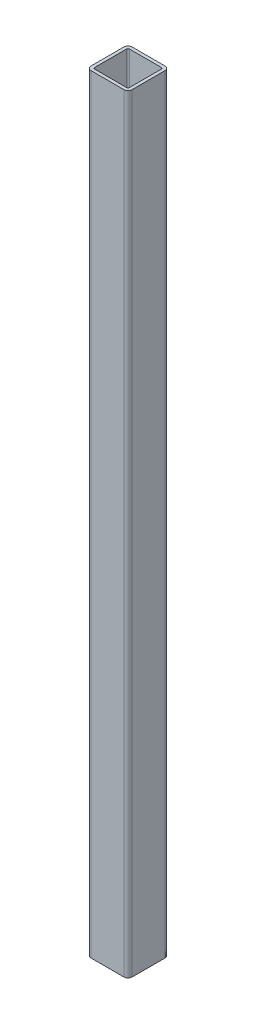
ISO-10303-21;
HEADER;
FILE_DESCRIPTION(('STEP AP214'),'2;1');
FILE_NAME('part.step','',(''),(''),'','','');
FILE_SCHEMA(('AUTOMOTIVE_DESIGN { 1 0 10303 214 1 1 1 1 }'));
ENDSEC;
DATA;
#1=APPLICATION_CONTEXT('core data for automotive mechanical design processes');
#2=APPLICATION_PROTOCOL_DEFINITION('international standard','automotive_design',2000,#1);
#3=PRODUCT_CONTEXT('',#1,'mechanical');
#4=PRODUCT('Part','Part','',(#3));
#5=PRODUCT_RELATED_PRODUCT_CATEGORY('part','',(#4));
#6=PRODUCT_DEFINITION_FORMATION('','',#4);
#7=PRODUCT_DEFINITION_CONTEXT('part definition',#1,'design');
#8=PRODUCT_DEFINITION('design','',#6,#7);
#9=PRODUCT_DEFINITION_SHAPE('','',#8);
#10=(LENGTH_UNIT() NAMED_UNIT(*) SI_UNIT(.MILLI.,.METRE.));
#11=(NAMED_UNIT(*) PLANE_ANGLE_UNIT() SI_UNIT($,.RADIAN.));
#12=(NAMED_UNIT(*) SI_UNIT($,.STERADIAN.) SOLID_ANGLE_UNIT());
#13=UNCERTAINTY_MEASURE_WITH_UNIT(LENGTH_MEASURE(1.E-05),#10,'distance_accuracy_value','');
#14=(GEOMETRIC_REPRESENTATION_CONTEXT(3) GLOBAL_UNCERTAINTY_ASSIGNED_CONTEXT((#13)) GLOBAL_UNIT_ASSIGNED_CONTEXT((#10,
#11,#12)) REPRESENTATION_CONTEXT('',''));
#15=CARTESIAN_POINT('',(0.,0.,0.));
#16=DIRECTION('',(0.,0.,1.));
#17=DIRECTION('',(1.,0.,0.));
#18=AXIS2_PLACEMENT_3D('',#15,#16,#17);
#19=CARTESIAN_POINT('',(16.,375.,-16.));
#20=DIRECTION('',(0.,-1.,0.));
#21=DIRECTION('',(0.,0.,-1.));
#22=AXIS2_PLACEMENT_3D('',#19,#20,#21);
#23=PLANE('',#22);
#24=CARTESIAN_POINT('',(16.,375.,-16.));
#25=DIRECTION('',(0.,1.,0.));
#26=DIRECTION('',(0.,0.,-1.));
#27=AXIS2_PLACEMENT_3D('',#24,#25,#26);
#28=CIRCLE('',#27,4.00000000000001);
#29=CARTESIAN_POINT('',(20.,375.,-16.));
#30=VERTEX_POINT('',#29);
#31=CARTESIAN_POINT('',(16.,375.,-20.));
#32=VERTEX_POINT('',#31);
#33=EDGE_CURVE('E220',#30,#32,#28,.T.);
#34=ORIENTED_EDGE('',*,*,#33,.T.);
#35=DIRECTION('',(-1.,0.,0.));
#36=VECTOR('',#35,1.);
#37=CARTESIAN_POINT('',(-16.,375.,-20.));
#38=LINE('',#37,#36);
#39=CARTESIAN_POINT('',(-16.,375.,-20.));
#40=VERTEX_POINT('',#39);
#41=EDGE_CURVE('E217',#32,#40,#38,.T.);
#42=ORIENTED_EDGE('',*,*,#41,.T.);
#43=CARTESIAN_POINT('',(-16.,375.,-16.));
#44=DIRECTION('',(0.,1.,0.));
#45=DIRECTION('',(0.,0.,-1.));
#46=AXIS2_PLACEMENT_3D('',#43,#44,#45);
#47=CIRCLE('',#46,4.00000000000001);
#48=CARTESIAN_POINT('',(-20.,375.,-16.));
#49=VERTEX_POINT('',#48);
#50=EDGE_CURVE('E223',#40,#49,#47,.T.);
#51=ORIENTED_EDGE('',*,*,#50,.T.);
#52=DIRECTION('',(0.,0.,1.));
#53=VECTOR('',#52,1.);
#54=CARTESIAN_POINT('',(-20.,375.,16.));
#55=LINE('',#54,#53);
#56=CARTESIAN_POINT('',(-20.,375.,16.));
#57=VERTEX_POINT('',#56);
#58=EDGE_CURVE('E224',#49,#57,#55,.T.);
#59=ORIENTED_EDGE('',*,*,#58,.T.);
#60=CARTESIAN_POINT('',(-16.,375.,16.));
#61=DIRECTION('',(0.,1.,0.));
#62=DIRECTION('',(0.,0.,-1.));
#63=AXIS2_PLACEMENT_3D('',#60,#61,#62);
#64=CIRCLE('',#63,4.00000000000001);
#65=CARTESIAN_POINT('',(-16.,375.,20.));
#66=VERTEX_POINT('',#65);
#67=EDGE_CURVE('E230',#57,#66,#64,.T.);
#68=ORIENTED_EDGE('',*,*,#67,.T.);
#69=DIRECTION('',(1.,0.,0.));
#70=VECTOR('',#69,1.);
#71=CARTESIAN_POINT('',(16.,375.,20.));
#72=LINE('',#71,#70);
#73=CARTESIAN_POINT('',(16.,375.,20.));
#74=VERTEX_POINT('',#73);
#75=EDGE_CURVE('E227',#66,#74,#72,.T.);
#76=ORIENTED_EDGE('',*,*,#75,.T.);
#77=CARTESIAN_POINT('',(16.,375.,16.));
#78=DIRECTION('',(0.,1.,0.));
#79=DIRECTION('',(0.,0.,-1.));
#80=AXIS2_PLACEMENT_3D('',#77,#78,#79);
#81=CIRCLE('',#80,4.00000000000001);
#82=CARTESIAN_POINT('',(20.,375.,16.));
#83=VERTEX_POINT('',#82);
#84=EDGE_CURVE('E231',#74,#83,#81,.T.);
#85=ORIENTED_EDGE('',*,*,#84,.T.);
#86=DIRECTION('',(0.,0.,-1.));
#87=VECTOR('',#86,1.);
#88=CARTESIAN_POINT('',(20.,375.,-16.));
#89=LINE('',#88,#87);
#90=EDGE_CURVE('E232',#83,#30,#89,.T.);
#91=ORIENTED_EDGE('',*,*,#90,.T.);
#92=EDGE_LOOP('',(#34,#42,#51,#59,#68,#76,#85,#91));
#93=FACE_BOUND('',#92,.T.);
#94=CARTESIAN_POINT('',(15.5,375.,-15.5));
#95=DIRECTION('',(0.,1.,0.));
#96=DIRECTION('',(0.,0.,-1.));
#97=AXIS2_PLACEMENT_3D('',#94,#95,#96);
#98=CIRCLE('',#97,1.5);
#99=CARTESIAN_POINT('',(17.,375.,-15.5));
#100=VERTEX_POINT('',#99);
#101=CARTESIAN_POINT('',(15.5,375.,-17.));
#102=VERTEX_POINT('',#101);
#103=EDGE_CURVE('E154',#100,#102,#98,.T.);
#104=ORIENTED_EDGE('',*,*,#103,.F.);
#105=DIRECTION('',(0.,0.,-1.));
#106=VECTOR('',#105,1.);
#107=CARTESIAN_POINT('',(17.,375.,-15.5));
#108=LINE('',#107,#106);
#109=CARTESIAN_POINT('',(17.,375.,15.5));
#110=VERTEX_POINT('',#109);
#111=EDGE_CURVE('E184',#110,#100,#108,.T.);
#112=ORIENTED_EDGE('',*,*,#111,.F.);
#113=CARTESIAN_POINT('',(15.5,375.,15.5));
#114=DIRECTION('',(0.,1.,0.));
#115=DIRECTION('',(0.,0.,-1.));
#116=AXIS2_PLACEMENT_3D('',#113,#114,#115);
#117=CIRCLE('',#116,1.5);
#118=CARTESIAN_POINT('',(15.5,375.,17.));
#119=VERTEX_POINT('',#118);
#120=EDGE_CURVE('E183',#119,#110,#117,.T.);
#121=ORIENTED_EDGE('',*,*,#120,.F.);
#122=DIRECTION('',(1.,0.,0.));
#123=VECTOR('',#122,1.);
#124=CARTESIAN_POINT('',(15.5,375.,17.));
#125=LINE('',#124,#123);
#126=CARTESIAN_POINT('',(-15.5,375.,17.));
#127=VERTEX_POINT('',#126);
#128=EDGE_CURVE('E181',#127,#119,#125,.T.);
#129=ORIENTED_EDGE('',*,*,#128,.F.);
#130=CARTESIAN_POINT('',(-15.5,375.,15.5));
#131=DIRECTION('',(0.,1.,0.));
#132=DIRECTION('',(0.,0.,-1.));
#133=AXIS2_PLACEMENT_3D('',#130,#131,#132);
#134=CIRCLE('',#133,1.5);
#135=CARTESIAN_POINT('',(-17.,375.,15.5));
#136=VERTEX_POINT('',#135);
#137=EDGE_CURVE('E177',#136,#127,#134,.T.);
#138=ORIENTED_EDGE('',*,*,#137,.F.);
#139=DIRECTION('',(0.,0.,1.));
#140=VECTOR('',#139,1.);
#141=CARTESIAN_POINT('',(-17.,375.,15.5));
#142=LINE('',#141,#140);
#143=CARTESIAN_POINT('',(-17.,375.,-15.5));
#144=VERTEX_POINT('',#143);
#145=EDGE_CURVE('E172',#144,#136,#142,.T.);
#146=ORIENTED_EDGE('',*,*,#145,.F.);
#147=CARTESIAN_POINT('',(-15.5,375.,-15.5));
#148=DIRECTION('',(0.,1.,0.));
#149=DIRECTION('',(0.,0.,-1.));
#150=AXIS2_PLACEMENT_3D('',#147,#148,#149);
#151=CIRCLE('',#150,1.5);
#152=CARTESIAN_POINT('',(-15.5,375.,-17.));
#153=VERTEX_POINT('',#152);
#154=EDGE_CURVE('E171',#153,#144,#151,.T.);
#155=ORIENTED_EDGE('',*,*,#154,.F.);
#156=DIRECTION('',(-1.,0.,0.));
#157=VECTOR('',#156,1.);
#158=CARTESIAN_POINT('',(-15.5,375.,-17.));
#159=LINE('',#158,#157);
#160=EDGE_CURVE('E158',#102,#153,#159,.T.);
#161=ORIENTED_EDGE('',*,*,#160,.F.);
#162=EDGE_LOOP('',(#104,#112,#121,#129,#138,#146,#155,#161));
#163=FACE_BOUND('',#162,.T.);
#164=ADVANCED_FACE('F39',(#93,#163),#23,.F.);
#165=CARTESIAN_POINT('',(16.,-375.,-16.));
#166=DIRECTION('',(0.,-1.,0.));
#167=DIRECTION('',(0.,0.,-1.));
#168=AXIS2_PLACEMENT_3D('',#165,#166,#167);
#169=PLANE('',#168);
#170=CARTESIAN_POINT('',(16.,-375.,-16.));
#171=DIRECTION('',(0.,1.,0.));
#172=DIRECTION('',(0.,0.,-1.));
#173=AXIS2_PLACEMENT_3D('',#170,#171,#172);
#174=CIRCLE('',#173,4.00000000000001);
#175=CARTESIAN_POINT('',(20.,-375.,-16.));
#176=VERTEX_POINT('',#175);
#177=CARTESIAN_POINT('',(16.,-375.,-20.));
#178=VERTEX_POINT('',#177);
#179=EDGE_CURVE('E166',#176,#178,#174,.T.);
#180=ORIENTED_EDGE('',*,*,#179,.F.);
#181=DIRECTION('',(0.,0.,-1.));
#182=VECTOR('',#181,1.);
#183=CARTESIAN_POINT('',(20.,-375.,-16.));
#184=LINE('',#183,#182);
#185=CARTESIAN_POINT('',(20.,-375.,16.));
#186=VERTEX_POINT('',#185);
#187=EDGE_CURVE('E221',#186,#176,#184,.T.);
#188=ORIENTED_EDGE('',*,*,#187,.F.);
#189=CARTESIAN_POINT('',(16.,-375.,16.));
#190=DIRECTION('',(0.,1.,0.));
#191=DIRECTION('',(0.,0.,-1.));
#192=AXIS2_PLACEMENT_3D('',#189,#190,#191);
#193=CIRCLE('',#192,4.00000000000001);
#194=CARTESIAN_POINT('',(16.,-375.,20.));
#195=VERTEX_POINT('',#194);
#196=EDGE_CURVE('E246',#195,#186,#193,.T.);
#197=ORIENTED_EDGE('',*,*,#196,.F.);
#198=DIRECTION('',(1.,0.,0.));
#199=VECTOR('',#198,1.);
#200=CARTESIAN_POINT('',(16.,-375.,20.));
#201=LINE('',#200,#199);
#202=CARTESIAN_POINT('',(-16.,-375.,20.));
#203=VERTEX_POINT('',#202);
#204=EDGE_CURVE('E247',#203,#195,#201,.T.);
#205=ORIENTED_EDGE('',*,*,#204,.F.);
#206=CARTESIAN_POINT('',(-16.,-375.,16.));
#207=DIRECTION('',(0.,1.,0.));
#208=DIRECTION('',(0.,0.,-1.));
#209=AXIS2_PLACEMENT_3D('',#206,#207,#208);
#210=CIRCLE('',#209,4.00000000000001);
#211=CARTESIAN_POINT('',(-20.,-375.,16.));
#212=VERTEX_POINT('',#211);
#213=EDGE_CURVE('E241',#212,#203,#210,.T.);
#214=ORIENTED_EDGE('',*,*,#213,.F.);
#215=DIRECTION('',(0.,0.,1.));
#216=VECTOR('',#215,1.);
#217=CARTESIAN_POINT('',(-20.,-375.,16.));
#218=LINE('',#217,#216);
#219=CARTESIAN_POINT('',(-20.,-375.,-16.));
#220=VERTEX_POINT('',#219);
#221=EDGE_CURVE('E244',#220,#212,#218,.T.);
#222=ORIENTED_EDGE('',*,*,#221,.F.);
#223=CARTESIAN_POINT('',(-16.,-375.,-16.));
#224=DIRECTION('',(0.,1.,0.));
#225=DIRECTION('',(0.,0.,-1.));
#226=AXIS2_PLACEMENT_3D('',#223,#224,#225);
#227=CIRCLE('',#226,4.00000000000001);
#228=CARTESIAN_POINT('',(-16.,-375.,-20.));
#229=VERTEX_POINT('',#228);
#230=EDGE_CURVE('E238',#229,#220,#227,.T.);
#231=ORIENTED_EDGE('',*,*,#230,.F.);
#232=DIRECTION('',(-1.,0.,0.));
#233=VECTOR('',#232,1.);
#234=CARTESIAN_POINT('',(-16.,-375.,-20.));
#235=LINE('',#234,#233);
#236=EDGE_CURVE('E239',#178,#229,#235,.T.);
#237=ORIENTED_EDGE('',*,*,#236,.F.);
#238=EDGE_LOOP('',(#180,#188,#197,#205,#214,#222,#231,#237));
#239=FACE_BOUND('',#238,.T.);
#240=DIRECTION('',(0.,0.,-1.));
#241=VECTOR('',#240,1.);
#242=CARTESIAN_POINT('',(17.,-375.,-15.5));
#243=LINE('',#242,#241);
#244=CARTESIAN_POINT('',(17.,-375.,15.5));
#245=VERTEX_POINT('',#244);
#246=CARTESIAN_POINT('',(17.,-375.,-15.5));
#247=VERTEX_POINT('',#246);
#248=EDGE_CURVE('E162',#245,#247,#243,.T.);
#249=ORIENTED_EDGE('',*,*,#248,.T.);
#250=CARTESIAN_POINT('',(15.5,-375.,-15.5));
#251=DIRECTION('',(0.,1.,0.));
#252=DIRECTION('',(0.,0.,-1.));
#253=AXIS2_PLACEMENT_3D('',#250,#251,#252);
#254=CIRCLE('',#253,1.5);
#255=CARTESIAN_POINT('',(15.5,-375.,-17.));
#256=VERTEX_POINT('',#255);
#257=EDGE_CURVE('E64',#247,#256,#254,.T.);
#258=ORIENTED_EDGE('',*,*,#257,.T.);
#259=DIRECTION('',(-1.,0.,0.));
#260=VECTOR('',#259,1.);
#261=CARTESIAN_POINT('',(-15.5,-375.,-17.));
#262=LINE('',#261,#260);
#263=CARTESIAN_POINT('',(-15.5,-375.,-17.));
#264=VERTEX_POINT('',#263);
#265=EDGE_CURVE('E167',#256,#264,#262,.T.);
#266=ORIENTED_EDGE('',*,*,#265,.T.);
#267=CARTESIAN_POINT('',(-15.5,-375.,-15.5));
#268=DIRECTION('',(0.,1.,0.));
#269=DIRECTION('',(0.,0.,-1.));
#270=AXIS2_PLACEMENT_3D('',#267,#268,#269);
#271=CIRCLE('',#270,1.5);
#272=CARTESIAN_POINT('',(-17.,-375.,-15.5));
#273=VERTEX_POINT('',#272);
#274=EDGE_CURVE('E188',#264,#273,#271,.T.);
#275=ORIENTED_EDGE('',*,*,#274,.T.);
#276=DIRECTION('',(0.,0.,1.));
#277=VECTOR('',#276,1.);
#278=CARTESIAN_POINT('',(-17.,-375.,15.5));
#279=LINE('',#278,#277);
#280=CARTESIAN_POINT('',(-17.,-375.,15.5));
#281=VERTEX_POINT('',#280);
#282=EDGE_CURVE('E195',#273,#281,#279,.T.);
#283=ORIENTED_EDGE('',*,*,#282,.T.);
#284=CARTESIAN_POINT('',(-15.5,-375.,15.5));
#285=DIRECTION('',(0.,1.,0.));
#286=DIRECTION('',(0.,0.,-1.));
#287=AXIS2_PLACEMENT_3D('',#284,#285,#286);
#288=CIRCLE('',#287,1.5);
#289=CARTESIAN_POINT('',(-15.5,-375.,17.));
#290=VERTEX_POINT('',#289);
#291=EDGE_CURVE('E193',#281,#290,#288,.T.);
#292=ORIENTED_EDGE('',*,*,#291,.T.);
#293=DIRECTION('',(1.,0.,0.));
#294=VECTOR('',#293,1.);
#295=CARTESIAN_POINT('',(15.5,-375.,17.));
#296=LINE('',#295,#294);
#297=CARTESIAN_POINT('',(15.5,-375.,17.));
#298=VERTEX_POINT('',#297);
#299=EDGE_CURVE('E200',#290,#298,#296,.T.);
#300=ORIENTED_EDGE('',*,*,#299,.T.);
#301=CARTESIAN_POINT('',(15.5,-375.,15.5));
#302=DIRECTION('',(0.,1.,0.));
#303=DIRECTION('',(0.,0.,-1.));
#304=AXIS2_PLACEMENT_3D('',#301,#302,#303);
#305=CIRCLE('',#304,1.5);
#306=EDGE_CURVE('E202',#298,#245,#305,.T.);
#307=ORIENTED_EDGE('',*,*,#306,.T.);
#308=EDGE_LOOP('',(#249,#258,#266,#275,#283,#292,#300,#307));
#309=FACE_BOUND('',#308,.T.);
#310=ADVANCED_FACE('F277',(#239,#309),#169,.T.);
#311=CARTESIAN_POINT('',(16.,375.,-16.));
#312=DIRECTION('',(0.,-1.,0.));
#313=DIRECTION('',(0.,0.,-1.));
#314=AXIS2_PLACEMENT_3D('',#311,#312,#313);
#315=CYLINDRICAL_SURFACE('',#314,4.00000000000001);
#316=ORIENTED_EDGE('',*,*,#179,.T.);
#317=DIRECTION('',(0.,-1.,0.));
#318=VECTOR('',#317,1.);
#319=CARTESIAN_POINT('',(16.,375.,-20.));
#320=LINE('',#319,#318);
#321=EDGE_CURVE('E11',#32,#178,#320,.T.);
#322=ORIENTED_EDGE('',*,*,#321,.F.);
#323=ORIENTED_EDGE('',*,*,#33,.F.);
#324=DIRECTION('',(0.,-1.,0.));
#325=VECTOR('',#324,1.);
#326=CARTESIAN_POINT('',(20.,375.,-16.));
#327=LINE('',#326,#325);
#328=EDGE_CURVE('E234',#30,#176,#327,.T.);
#329=ORIENTED_EDGE('',*,*,#328,.T.);
#330=EDGE_LOOP('',(#316,#322,#323,#329));
#331=FACE_BOUND('',#330,.T.);
#332=ADVANCED_FACE('F41',(#331),#315,.T.);
#333=CARTESIAN_POINT('',(-16.,375.,-20.));
#334=DIRECTION('',(0.,0.,1.));
#335=DIRECTION('',(1.,0.,0.));
#336=AXIS2_PLACEMENT_3D('',#333,#334,#335);
#337=PLANE('',#336);
#338=ORIENTED_EDGE('',*,*,#236,.T.);
#339=DIRECTION('',(0.,-1.,0.));
#340=VECTOR('',#339,1.);
#341=CARTESIAN_POINT('',(-16.,375.,-20.));
#342=LINE('',#341,#340);
#343=EDGE_CURVE('E50',#40,#229,#342,.T.);
#344=ORIENTED_EDGE('',*,*,#343,.F.);
#345=ORIENTED_EDGE('',*,*,#41,.F.);
#346=ORIENTED_EDGE('',*,*,#321,.T.);
#347=EDGE_LOOP('',(#338,#344,#345,#346));
#348=FACE_BOUND('',#347,.T.);
#349=ADVANCED_FACE('F293',(#348),#337,.F.);
#350=CARTESIAN_POINT('',(-16.,375.,-16.));
#351=DIRECTION('',(0.,-1.,0.));
#352=DIRECTION('',(0.,0.,-1.));
#353=AXIS2_PLACEMENT_3D('',#350,#351,#352);
#354=CYLINDRICAL_SURFACE('',#353,4.00000000000001);
#355=ORIENTED_EDGE('',*,*,#230,.T.);
#356=DIRECTION('',(0.,-1.,0.));
#357=VECTOR('',#356,1.);
#358=CARTESIAN_POINT('',(-20.,375.,-16.));
#359=LINE('',#358,#357);
#360=EDGE_CURVE('E262',#49,#220,#359,.T.);
#361=ORIENTED_EDGE('',*,*,#360,.F.);
#362=ORIENTED_EDGE('',*,*,#50,.F.);
#363=ORIENTED_EDGE('',*,*,#343,.T.);
#364=EDGE_LOOP('',(#355,#361,#362,#363));
#365=FACE_BOUND('',#364,.T.);
#366=ADVANCED_FACE('F275',(#365),#354,.T.);
#367=CARTESIAN_POINT('',(-20.,375.,16.));
#368=DIRECTION('',(1.,0.,0.));
#369=DIRECTION('',(0.,0.,-1.));
#370=AXIS2_PLACEMENT_3D('',#367,#368,#369);
#371=PLANE('',#370);
#372=ORIENTED_EDGE('',*,*,#221,.T.);
#373=DIRECTION('',(0.,-1.,0.));
#374=VECTOR('',#373,1.);
#375=CARTESIAN_POINT('',(-20.,375.,16.));
#376=LINE('',#375,#374);
#377=EDGE_CURVE('E265',#57,#212,#376,.T.);
#378=ORIENTED_EDGE('',*,*,#377,.F.);
#379=ORIENTED_EDGE('',*,*,#58,.F.);
#380=ORIENTED_EDGE('',*,*,#360,.T.);
#381=EDGE_LOOP('',(#372,#378,#379,#380));
#382=FACE_BOUND('',#381,.T.);
#383=ADVANCED_FACE('F281',(#382),#371,.F.);
#384=CARTESIAN_POINT('',(-16.,375.,16.));
#385=DIRECTION('',(0.,-1.,0.));
#386=DIRECTION('',(0.,0.,-1.));
#387=AXIS2_PLACEMENT_3D('',#384,#385,#386);
#388=CYLINDRICAL_SURFACE('',#387,4.00000000000001);
#389=ORIENTED_EDGE('',*,*,#213,.T.);
#390=DIRECTION('',(0.,-1.,0.));
#391=VECTOR('',#390,1.);
#392=CARTESIAN_POINT('',(-16.,375.,20.));
#393=LINE('',#392,#391);
#394=EDGE_CURVE('E260',#66,#203,#393,.T.);
#395=ORIENTED_EDGE('',*,*,#394,.F.);
#396=ORIENTED_EDGE('',*,*,#67,.F.);
#397=ORIENTED_EDGE('',*,*,#377,.T.);
#398=EDGE_LOOP('',(#389,#395,#396,#397));
#399=FACE_BOUND('',#398,.T.);
#400=ADVANCED_FACE('F290',(#399),#388,.T.);
#401=CARTESIAN_POINT('',(16.,375.,20.));
#402=DIRECTION('',(0.,0.,-1.));
#403=DIRECTION('',(-1.,0.,0.));
#404=AXIS2_PLACEMENT_3D('',#401,#402,#403);
#405=PLANE('',#404);
#406=ORIENTED_EDGE('',*,*,#204,.T.);
#407=DIRECTION('',(0.,-1.,0.));
#408=VECTOR('',#407,1.);
#409=CARTESIAN_POINT('',(16.,375.,20.));
#410=LINE('',#409,#408);
#411=EDGE_CURVE('E258',#74,#195,#410,.T.);
#412=ORIENTED_EDGE('',*,*,#411,.F.);
#413=ORIENTED_EDGE('',*,*,#75,.F.);
#414=ORIENTED_EDGE('',*,*,#394,.T.);
#415=EDGE_LOOP('',(#406,#412,#413,#414));
#416=FACE_BOUND('',#415,.T.);
#417=ADVANCED_FACE('F306',(#416),#405,.F.);
#418=CARTESIAN_POINT('',(16.,375.,16.));
#419=DIRECTION('',(0.,-1.,0.));
#420=DIRECTION('',(0.,0.,-1.));
#421=AXIS2_PLACEMENT_3D('',#418,#419,#420);
#422=CYLINDRICAL_SURFACE('',#421,4.00000000000001);
#423=ORIENTED_EDGE('',*,*,#196,.T.);
#424=DIRECTION('',(0.,-1.,0.));
#425=VECTOR('',#424,1.);
#426=CARTESIAN_POINT('',(20.,375.,16.));
#427=LINE('',#426,#425);
#428=EDGE_CURVE('E255',#83,#186,#427,.T.);
#429=ORIENTED_EDGE('',*,*,#428,.F.);
#430=ORIENTED_EDGE('',*,*,#84,.F.);
#431=ORIENTED_EDGE('',*,*,#411,.T.);
#432=EDGE_LOOP('',(#423,#429,#430,#431));
#433=FACE_BOUND('',#432,.T.);
#434=ADVANCED_FACE('F308',(#433),#422,.T.);
#435=CARTESIAN_POINT('',(20.,375.,-16.));
#436=DIRECTION('',(-1.,0.,0.));
#437=DIRECTION('',(0.,0.,1.));
#438=AXIS2_PLACEMENT_3D('',#435,#436,#437);
#439=PLANE('',#438);
#440=ORIENTED_EDGE('',*,*,#187,.T.);
#441=ORIENTED_EDGE('',*,*,#328,.F.);
#442=ORIENTED_EDGE('',*,*,#90,.F.);
#443=ORIENTED_EDGE('',*,*,#428,.T.);
#444=EDGE_LOOP('',(#440,#441,#442,#443));
#445=FACE_BOUND('',#444,.T.);
#446=ADVANCED_FACE('F303',(#445),#439,.F.);
#447=CARTESIAN_POINT('',(15.5,375.,-15.5));
#448=DIRECTION('',(0.,-1.,0.));
#449=DIRECTION('',(0.,0.,-1.));
#450=AXIS2_PLACEMENT_3D('',#447,#448,#449);
#451=CYLINDRICAL_SURFACE('',#450,1.5);
#452=ORIENTED_EDGE('',*,*,#257,.F.);
#453=DIRECTION('',(0.,-1.,0.));
#454=VECTOR('',#453,1.);
#455=CARTESIAN_POINT('',(17.,375.,-15.5));
#456=LINE('',#455,#454);
#457=EDGE_CURVE('E157',#100,#247,#456,.T.);
#458=ORIENTED_EDGE('',*,*,#457,.F.);
#459=ORIENTED_EDGE('',*,*,#103,.T.);
#460=DIRECTION('',(0.,-1.,0.));
#461=VECTOR('',#460,1.);
#462=CARTESIAN_POINT('',(15.5,375.,-17.));
#463=LINE('',#462,#461);
#464=EDGE_CURVE('E153',#102,#256,#463,.T.);
#465=ORIENTED_EDGE('',*,*,#464,.T.);
#466=EDGE_LOOP('',(#452,#458,#459,#465));
#467=FACE_BOUND('',#466,.T.);
#468=ADVANCED_FACE('F151',(#467),#451,.F.);
#469=CARTESIAN_POINT('',(-15.5,375.,-17.));
#470=DIRECTION('',(0.,0.,1.));
#471=DIRECTION('',(1.,0.,0.));
#472=AXIS2_PLACEMENT_3D('',#469,#470,#471);
#473=PLANE('',#472);
#474=ORIENTED_EDGE('',*,*,#265,.F.);
#475=ORIENTED_EDGE('',*,*,#464,.F.);
#476=ORIENTED_EDGE('',*,*,#160,.T.);
#477=DIRECTION('',(0.,-1.,0.));
#478=VECTOR('',#477,1.);
#479=CARTESIAN_POINT('',(-15.5,375.,-17.));
#480=LINE('',#479,#478);
#481=EDGE_CURVE('E170',#153,#264,#480,.T.);
#482=ORIENTED_EDGE('',*,*,#481,.T.);
#483=EDGE_LOOP('',(#474,#475,#476,#482));
#484=FACE_BOUND('',#483,.T.);
#485=ADVANCED_FACE('F161',(#484),#473,.T.);
#486=CARTESIAN_POINT('',(-15.5,375.,-15.5));
#487=DIRECTION('',(0.,-1.,0.));
#488=DIRECTION('',(0.,0.,-1.));
#489=AXIS2_PLACEMENT_3D('',#486,#487,#488);
#490=CYLINDRICAL_SURFACE('',#489,1.5);
#491=ORIENTED_EDGE('',*,*,#274,.F.);
#492=ORIENTED_EDGE('',*,*,#481,.F.);
#493=ORIENTED_EDGE('',*,*,#154,.T.);
#494=DIRECTION('',(0.,-1.,0.));
#495=VECTOR('',#494,1.);
#496=CARTESIAN_POINT('',(-17.,375.,-15.5));
#497=LINE('',#496,#495);
#498=EDGE_CURVE('E215',#144,#273,#497,.T.);
#499=ORIENTED_EDGE('',*,*,#498,.T.);
#500=EDGE_LOOP('',(#491,#492,#493,#499));
#501=FACE_BOUND('',#500,.T.);
#502=ADVANCED_FACE('F335',(#501),#490,.F.);
#503=CARTESIAN_POINT('',(-17.,375.,15.5));
#504=DIRECTION('',(1.,0.,0.));
#505=DIRECTION('',(0.,0.,-1.));
#506=AXIS2_PLACEMENT_3D('',#503,#504,#505);
#507=PLANE('',#506);
#508=ORIENTED_EDGE('',*,*,#282,.F.);
#509=ORIENTED_EDGE('',*,*,#498,.F.);
#510=ORIENTED_EDGE('',*,*,#145,.T.);
#511=DIRECTION('',(0.,-1.,0.));
#512=VECTOR('',#511,1.);
#513=CARTESIAN_POINT('',(-17.,375.,15.5));
#514=LINE('',#513,#512);
#515=EDGE_CURVE('E212',#136,#281,#514,.T.);
#516=ORIENTED_EDGE('',*,*,#515,.T.);
#517=EDGE_LOOP('',(#508,#509,#510,#516));
#518=FACE_BOUND('',#517,.T.);
#519=ADVANCED_FACE('F340',(#518),#507,.T.);
#520=CARTESIAN_POINT('',(-15.5,375.,15.5));
#521=DIRECTION('',(0.,-1.,0.));
#522=DIRECTION('',(0.,0.,-1.));
#523=AXIS2_PLACEMENT_3D('',#520,#521,#522);
#524=CYLINDRICAL_SURFACE('',#523,1.5);
#525=ORIENTED_EDGE('',*,*,#291,.F.);
#526=ORIENTED_EDGE('',*,*,#515,.F.);
#527=ORIENTED_EDGE('',*,*,#137,.T.);
#528=DIRECTION('',(0.,-1.,0.));
#529=VECTOR('',#528,1.);
#530=CARTESIAN_POINT('',(-15.5,375.,17.));
#531=LINE('',#530,#529);
#532=EDGE_CURVE('E208',#127,#290,#531,.T.);
#533=ORIENTED_EDGE('',*,*,#532,.T.);
#534=EDGE_LOOP('',(#525,#526,#527,#533));
#535=FACE_BOUND('',#534,.T.);
#536=ADVANCED_FACE('F345',(#535),#524,.F.);
#537=CARTESIAN_POINT('',(15.5,375.,17.));
#538=DIRECTION('',(0.,0.,-1.));
#539=DIRECTION('',(-1.,0.,0.));
#540=AXIS2_PLACEMENT_3D('',#537,#538,#539);
#541=PLANE('',#540);
#542=ORIENTED_EDGE('',*,*,#299,.F.);
#543=ORIENTED_EDGE('',*,*,#532,.F.);
#544=ORIENTED_EDGE('',*,*,#128,.T.);
#545=DIRECTION('',(0.,-1.,0.));
#546=VECTOR('',#545,1.);
#547=CARTESIAN_POINT('',(15.5,375.,17.));
#548=LINE('',#547,#546);
#549=EDGE_CURVE('E210',#119,#298,#548,.T.);
#550=ORIENTED_EDGE('',*,*,#549,.T.);
#551=EDGE_LOOP('',(#542,#543,#544,#550));
#552=FACE_BOUND('',#551,.T.);
#553=ADVANCED_FACE('F347',(#552),#541,.T.);
#554=CARTESIAN_POINT('',(15.5,375.,15.5));
#555=DIRECTION('',(0.,-1.,0.));
#556=DIRECTION('',(0.,0.,-1.));
#557=AXIS2_PLACEMENT_3D('',#554,#555,#556);
#558=CYLINDRICAL_SURFACE('',#557,1.5);
#559=ORIENTED_EDGE('',*,*,#306,.F.);
#560=ORIENTED_EDGE('',*,*,#549,.F.);
#561=ORIENTED_EDGE('',*,*,#120,.T.);
#562=DIRECTION('',(0.,-1.,0.));
#563=VECTOR('',#562,1.);
#564=CARTESIAN_POINT('',(17.,375.,15.5));
#565=LINE('',#564,#563);
#566=EDGE_CURVE('E53',#110,#245,#565,.T.);
#567=ORIENTED_EDGE('',*,*,#566,.T.);
#568=EDGE_LOOP('',(#559,#560,#561,#567));
#569=FACE_BOUND('',#568,.T.);
#570=ADVANCED_FACE('F353',(#569),#558,.F.);
#571=CARTESIAN_POINT('',(17.,375.,-15.5));
#572=DIRECTION('',(-1.,0.,0.));
#573=DIRECTION('',(0.,0.,1.));
#574=AXIS2_PLACEMENT_3D('',#571,#572,#573);
#575=PLANE('',#574);
#576=ORIENTED_EDGE('',*,*,#248,.F.);
#577=ORIENTED_EDGE('',*,*,#566,.F.);
#578=ORIENTED_EDGE('',*,*,#111,.T.);
#579=ORIENTED_EDGE('',*,*,#457,.T.);
#580=EDGE_LOOP('',(#576,#577,#578,#579));
#581=FACE_BOUND('',#580,.T.);
#582=ADVANCED_FACE('F352',(#581),#575,.T.);
#583=CLOSED_SHELL('',(#164,#310,#332,#349,#366,#383,#400,#417,#434,#446,#468,#485,#502,#519,
#536,#553,#570,#582));
#584=MANIFOLD_SOLID_BREP('B2',#583);
#585=ADVANCED_BREP_SHAPE_REPRESENTATION('',(#18,#584),#14);
#586=SHAPE_DEFINITION_REPRESENTATION(#9,#585);
ENDSEC;
END-ISO-10303-21;
